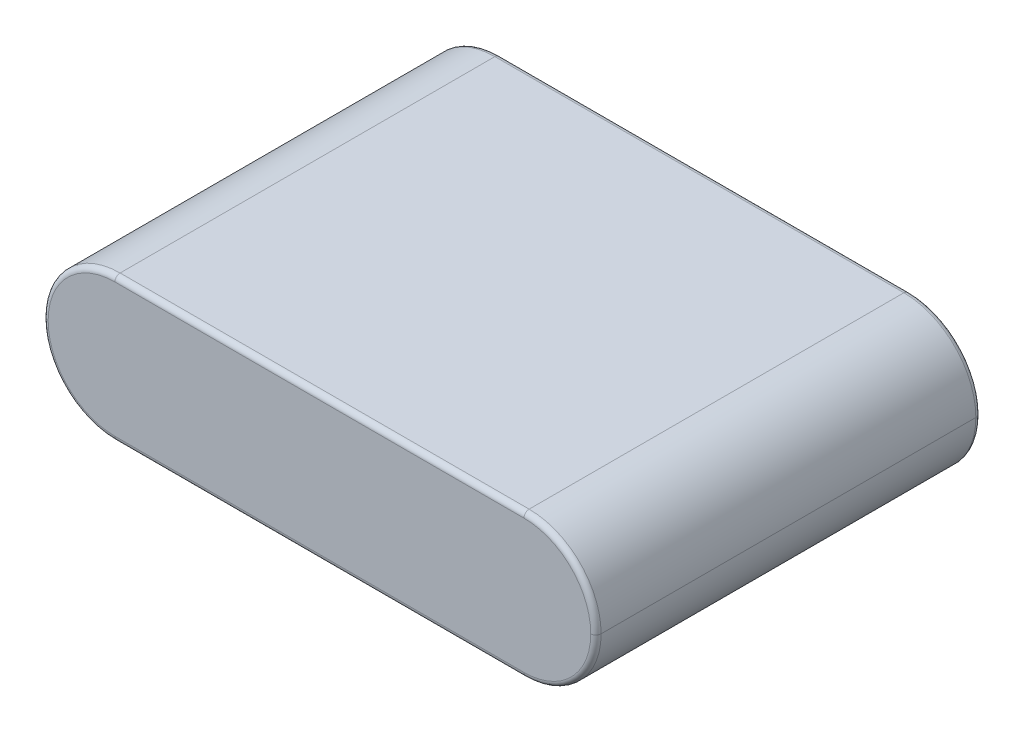
ISO-10303-21;
HEADER;
FILE_DESCRIPTION(('STEP AP214'),'2;1');
FILE_NAME('part.step','',(''),(''),'','','');
FILE_SCHEMA(('AUTOMOTIVE_DESIGN { 1 0 10303 214 1 1 1 1 }'));
ENDSEC;
DATA;
#1=APPLICATION_CONTEXT('core data for automotive mechanical design processes');
#2=APPLICATION_PROTOCOL_DEFINITION('international standard','automotive_design',2000,#1);
#3=PRODUCT_CONTEXT('',#1,'mechanical');
#4=PRODUCT('Part','Part','',(#3));
#5=PRODUCT_RELATED_PRODUCT_CATEGORY('part','',(#4));
#6=PRODUCT_DEFINITION_FORMATION('','',#4);
#7=PRODUCT_DEFINITION_CONTEXT('part definition',#1,'design');
#8=PRODUCT_DEFINITION('design','',#6,#7);
#9=PRODUCT_DEFINITION_SHAPE('','',#8);
#10=(LENGTH_UNIT() NAMED_UNIT(*) SI_UNIT(.MILLI.,.METRE.));
#11=(NAMED_UNIT(*) PLANE_ANGLE_UNIT() SI_UNIT($,.RADIAN.));
#12=(NAMED_UNIT(*) SI_UNIT($,.STERADIAN.) SOLID_ANGLE_UNIT());
#13=UNCERTAINTY_MEASURE_WITH_UNIT(LENGTH_MEASURE(1.E-05),#10,'distance_accuracy_value','');
#14=(GEOMETRIC_REPRESENTATION_CONTEXT(3) GLOBAL_UNCERTAINTY_ASSIGNED_CONTEXT((#13)) GLOBAL_UNIT_ASSIGNED_CONTEXT((#10,
#11,#12)) REPRESENTATION_CONTEXT('',''));
#15=CARTESIAN_POINT('',(0.,0.,0.));
#16=DIRECTION('',(0.,0.,1.));
#17=DIRECTION('',(1.,0.,0.));
#18=AXIS2_PLACEMENT_3D('',#15,#16,#17);
#19=CARTESIAN_POINT('',(0.,27.7,0.));
#20=DIRECTION('',(0.,0.,-1.));
#21=DIRECTION('',(-1.,0.,0.));
#22=AXIS2_PLACEMENT_3D('',#19,#20,#21);
#23=PLANE('',#22);
#24=CARTESIAN_POINT('',(92.55,13.85,0.));
#25=DIRECTION('',(0.,0.,-1.));
#26=DIRECTION('',(-1.,0.,0.));
#27=AXIS2_PLACEMENT_3D('',#24,#25,#26);
#28=CIRCLE('',#27,12.85);
#29=CARTESIAN_POINT('',(105.4,13.85,0.));
#30=VERTEX_POINT('',#29);
#31=CARTESIAN_POINT('',(92.55,26.7,0.));
#32=VERTEX_POINT('',#31);
#33=EDGE_CURVE('E49',#30,#32,#28,.F.);
#34=ORIENTED_EDGE('',*,*,#33,.T.);
#35=DIRECTION('',(1.,0.,0.));
#36=VECTOR('',#35,1.);
#37=CARTESIAN_POINT('',(0.,26.7,0.));
#38=LINE('',#37,#36);
#39=CARTESIAN_POINT('',(13.85,26.7,0.));
#40=VERTEX_POINT('',#39);
#41=EDGE_CURVE('E11',#32,#40,#38,.F.);
#42=ORIENTED_EDGE('',*,*,#41,.T.);
#43=CARTESIAN_POINT('',(13.85,13.85,0.));
#44=DIRECTION('',(0.,0.,-1.));
#45=DIRECTION('',(-1.,0.,0.));
#46=AXIS2_PLACEMENT_3D('',#43,#44,#45);
#47=CIRCLE('',#46,12.85);
#48=CARTESIAN_POINT('',(1.,13.85,0.));
#49=VERTEX_POINT('',#48);
#50=EDGE_CURVE('E200',#40,#49,#47,.F.);
#51=ORIENTED_EDGE('',*,*,#50,.T.);
#52=CARTESIAN_POINT('',(13.85,13.85,0.));
#53=DIRECTION('',(0.,0.,-1.));
#54=DIRECTION('',(-1.,0.,0.));
#55=AXIS2_PLACEMENT_3D('',#52,#53,#54);
#56=CIRCLE('',#55,12.85);
#57=CARTESIAN_POINT('',(13.85,0.999999999999999,0.));
#58=VERTEX_POINT('',#57);
#59=EDGE_CURVE('E203',#49,#58,#56,.F.);
#60=ORIENTED_EDGE('',*,*,#59,.T.);
#61=DIRECTION('',(1.,0.,0.));
#62=VECTOR('',#61,1.);
#63=CARTESIAN_POINT('',(92.55,1.,0.));
#64=LINE('',#63,#62);
#65=CARTESIAN_POINT('',(92.55,1.,0.));
#66=VERTEX_POINT('',#65);
#67=EDGE_CURVE('E206',#58,#66,#64,.T.);
#68=ORIENTED_EDGE('',*,*,#67,.T.);
#69=CARTESIAN_POINT('',(92.55,13.85,0.));
#70=DIRECTION('',(0.,0.,-1.));
#71=DIRECTION('',(-1.,0.,0.));
#72=AXIS2_PLACEMENT_3D('',#69,#70,#71);
#73=CIRCLE('',#72,12.85);
#74=EDGE_CURVE('E60',#66,#30,#73,.F.);
#75=ORIENTED_EDGE('',*,*,#74,.T.);
#76=EDGE_LOOP('',(#34,#42,#51,#60,#68,#75));
#77=FACE_BOUND('',#76,.T.);
#78=ADVANCED_FACE('F39',(#77),#23,.F.);
#79=CARTESIAN_POINT('',(0.,27.7,-74.1));
#80=DIRECTION('',(0.,0.,1.));
#81=DIRECTION('',(1.,0.,0.));
#82=AXIS2_PLACEMENT_3D('',#79,#80,#81);
#83=PLANE('',#82);
#84=CARTESIAN_POINT('',(92.55,13.85,-74.1));
#85=DIRECTION('',(0.,0.,1.));
#86=DIRECTION('',(1.,0.,0.));
#87=AXIS2_PLACEMENT_3D('',#84,#85,#86);
#88=CIRCLE('',#87,12.85);
#89=CARTESIAN_POINT('',(92.55,26.7,-74.1));
#90=VERTEX_POINT('',#89);
#91=CARTESIAN_POINT('',(105.4,13.85,-74.1));
#92=VERTEX_POINT('',#91);
#93=EDGE_CURVE('E155',#90,#92,#88,.F.);
#94=ORIENTED_EDGE('',*,*,#93,.T.);
#95=CARTESIAN_POINT('',(92.55,13.85,-74.1));
#96=DIRECTION('',(0.,0.,1.));
#97=DIRECTION('',(1.,0.,0.));
#98=AXIS2_PLACEMENT_3D('',#95,#96,#97);
#99=CIRCLE('',#98,12.85);
#100=CARTESIAN_POINT('',(92.55,1.,-74.1));
#101=VERTEX_POINT('',#100);
#102=EDGE_CURVE('E134',#92,#101,#99,.F.);
#103=ORIENTED_EDGE('',*,*,#102,.T.);
#104=DIRECTION('',(-1.,0.,0.));
#105=VECTOR('',#104,1.);
#106=CARTESIAN_POINT('',(13.85,1.,-74.1));
#107=LINE('',#106,#105);
#108=CARTESIAN_POINT('',(13.85,1.,-74.1));
#109=VERTEX_POINT('',#108);
#110=EDGE_CURVE('E143',#101,#109,#107,.T.);
#111=ORIENTED_EDGE('',*,*,#110,.T.);
#112=CARTESIAN_POINT('',(13.85,13.85,-74.1));
#113=DIRECTION('',(0.,0.,1.));
#114=DIRECTION('',(1.,0.,0.));
#115=AXIS2_PLACEMENT_3D('',#112,#113,#114);
#116=CIRCLE('',#115,12.85);
#117=CARTESIAN_POINT('',(1.,13.85,-74.1));
#118=VERTEX_POINT('',#117);
#119=EDGE_CURVE('E150',#109,#118,#116,.F.);
#120=ORIENTED_EDGE('',*,*,#119,.T.);
#121=CARTESIAN_POINT('',(13.85,13.85,-74.1));
#122=DIRECTION('',(0.,0.,1.));
#123=DIRECTION('',(1.,0.,0.));
#124=AXIS2_PLACEMENT_3D('',#121,#122,#123);
#125=CIRCLE('',#124,12.85);
#126=CARTESIAN_POINT('',(13.85,26.7,-74.1));
#127=VERTEX_POINT('',#126);
#128=EDGE_CURVE('E295',#118,#127,#125,.F.);
#129=ORIENTED_EDGE('',*,*,#128,.T.);
#130=DIRECTION('',(-1.,0.,0.));
#131=VECTOR('',#130,1.);
#132=CARTESIAN_POINT('',(0.,26.7,-74.1));
#133=LINE('',#132,#131);
#134=EDGE_CURVE('E163',#127,#90,#133,.F.);
#135=ORIENTED_EDGE('',*,*,#134,.T.);
#136=EDGE_LOOP('',(#94,#103,#111,#120,#129,#135));
#137=FACE_BOUND('',#136,.T.);
#138=ADVANCED_FACE('F153',(#137),#83,.F.);
#139=CARTESIAN_POINT('',(0.,27.7,0.));
#140=DIRECTION('',(0.,-1.,0.));
#141=DIRECTION('',(0.,0.,-1.));
#142=AXIS2_PLACEMENT_3D('',#139,#140,#141);
#143=PLANE('',#142);
#144=DIRECTION('',(0.,0.,-1.));
#145=VECTOR('',#144,1.);
#146=CARTESIAN_POINT('',(92.55,27.7,0.));
#147=LINE('',#146,#145);
#148=CARTESIAN_POINT('',(92.55,27.7,-1.));
#149=VERTEX_POINT('',#148);
#150=CARTESIAN_POINT('',(92.55,27.7,-73.1));
#151=VERTEX_POINT('',#150);
#152=EDGE_CURVE('E280',#149,#151,#147,.T.);
#153=ORIENTED_EDGE('',*,*,#152,.T.);
#154=DIRECTION('',(-1.,0.,0.));
#155=VECTOR('',#154,1.);
#156=CARTESIAN_POINT('',(0.,27.7,-73.1));
#157=LINE('',#156,#155);
#158=CARTESIAN_POINT('',(13.85,27.7,-73.1));
#159=VERTEX_POINT('',#158);
#160=EDGE_CURVE('E179',#151,#159,#157,.T.);
#161=ORIENTED_EDGE('',*,*,#160,.T.);
#162=DIRECTION('',(0.,0.,1.));
#163=VECTOR('',#162,1.);
#164=CARTESIAN_POINT('',(13.85,27.7,0.));
#165=LINE('',#164,#163);
#166=CARTESIAN_POINT('',(13.85,27.7,-1.));
#167=VERTEX_POINT('',#166);
#168=EDGE_CURVE('E151',#159,#167,#165,.T.);
#169=ORIENTED_EDGE('',*,*,#168,.T.);
#170=DIRECTION('',(1.,0.,0.));
#171=VECTOR('',#170,1.);
#172=CARTESIAN_POINT('',(0.,27.7,-1.));
#173=LINE('',#172,#171);
#174=EDGE_CURVE('E175',#167,#149,#173,.T.);
#175=ORIENTED_EDGE('',*,*,#174,.T.);
#176=EDGE_LOOP('',(#153,#161,#169,#175));
#177=FACE_BOUND('',#176,.T.);
#178=ADVANCED_FACE('F276',(#177),#143,.F.);
#179=CARTESIAN_POINT('',(0.,0.,0.));
#180=DIRECTION('',(0.,-1.,0.));
#181=DIRECTION('',(0.,0.,-1.));
#182=AXIS2_PLACEMENT_3D('',#179,#180,#181);
#183=PLANE('',#182);
#184=DIRECTION('',(0.,0.,1.));
#185=VECTOR('',#184,1.);
#186=CARTESIAN_POINT('',(13.85,0.,-74.1));
#187=LINE('',#186,#185);
#188=CARTESIAN_POINT('',(13.85,0.,-1.));
#189=VERTEX_POINT('',#188);
#190=CARTESIAN_POINT('',(13.85,0.,-73.1));
#191=VERTEX_POINT('',#190);
#192=EDGE_CURVE('E283',#189,#191,#187,.F.);
#193=ORIENTED_EDGE('',*,*,#192,.T.);
#194=DIRECTION('',(-1.,0.,0.));
#195=VECTOR('',#194,1.);
#196=CARTESIAN_POINT('',(92.55,0.,-73.1));
#197=LINE('',#196,#195);
#198=CARTESIAN_POINT('',(92.55,0.,-73.1));
#199=VERTEX_POINT('',#198);
#200=EDGE_CURVE('E197',#191,#199,#197,.F.);
#201=ORIENTED_EDGE('',*,*,#200,.T.);
#202=DIRECTION('',(0.,0.,-1.));
#203=VECTOR('',#202,1.);
#204=CARTESIAN_POINT('',(92.55,0.,0.));
#205=LINE('',#204,#203);
#206=CARTESIAN_POINT('',(92.55,0.,-1.));
#207=VERTEX_POINT('',#206);
#208=EDGE_CURVE('E289',#199,#207,#205,.F.);
#209=ORIENTED_EDGE('',*,*,#208,.T.);
#210=DIRECTION('',(1.,0.,0.));
#211=VECTOR('',#210,1.);
#212=CARTESIAN_POINT('',(13.85,0.,-1.));
#213=LINE('',#212,#211);
#214=EDGE_CURVE('E194',#207,#189,#213,.F.);
#215=ORIENTED_EDGE('',*,*,#214,.T.);
#216=EDGE_LOOP('',(#193,#201,#209,#215));
#217=FACE_BOUND('',#216,.T.);
#218=ADVANCED_FACE('F321',(#217),#183,.T.);
#219=CARTESIAN_POINT('',(13.85,13.85,0.));
#220=DIRECTION('',(0.,0.,1.));
#221=DIRECTION('',(1.,0.,0.));
#222=AXIS2_PLACEMENT_3D('',#219,#220,#221);
#223=CYLINDRICAL_SURFACE('',#222,13.85);
#224=ORIENTED_EDGE('',*,*,#168,.F.);
#225=CARTESIAN_POINT('',(13.85,13.85,-73.1));
#226=DIRECTION('',(0.,0.,1.));
#227=DIRECTION('',(1.,0.,0.));
#228=AXIS2_PLACEMENT_3D('',#225,#226,#227);
#229=CIRCLE('',#228,13.85);
#230=CARTESIAN_POINT('',(0.,13.85,-73.1));
#231=VERTEX_POINT('',#230);
#232=EDGE_CURVE('E185',#159,#231,#229,.T.);
#233=ORIENTED_EDGE('',*,*,#232,.T.);
#234=DIRECTION('',(0.,0.,1.));
#235=VECTOR('',#234,1.);
#236=CARTESIAN_POINT('',(0.,13.85,0.));
#237=LINE('',#236,#235);
#238=CARTESIAN_POINT('',(0.,13.85,-1.));
#239=VERTEX_POINT('',#238);
#240=EDGE_CURVE('E273',#239,#231,#237,.F.);
#241=ORIENTED_EDGE('',*,*,#240,.F.);
#242=CARTESIAN_POINT('',(13.85,13.85,-1.));
#243=DIRECTION('',(0.,0.,-1.));
#244=DIRECTION('',(-1.,0.,0.));
#245=AXIS2_PLACEMENT_3D('',#242,#243,#244);
#246=CIRCLE('',#245,13.85);
#247=EDGE_CURVE('E182',#239,#167,#246,.T.);
#248=ORIENTED_EDGE('',*,*,#247,.T.);
#249=EDGE_LOOP('',(#224,#233,#241,#248));
#250=FACE_BOUND('',#249,.T.);
#251=ADVANCED_FACE('F270',(#250),#223,.T.);
#252=CARTESIAN_POINT('',(13.85,13.85,0.));
#253=DIRECTION('',(0.,0.,-1.));
#254=DIRECTION('',(-1.,0.,0.));
#255=AXIS2_PLACEMENT_3D('',#252,#253,#254);
#256=CYLINDRICAL_SURFACE('',#255,13.85);
#257=ORIENTED_EDGE('',*,*,#240,.T.);
#258=CARTESIAN_POINT('',(13.85,13.85,-73.1));
#259=DIRECTION('',(0.,0.,1.));
#260=DIRECTION('',(1.,0.,0.));
#261=AXIS2_PLACEMENT_3D('',#258,#259,#260);
#262=CIRCLE('',#261,13.85);
#263=EDGE_CURVE('E191',#231,#191,#262,.T.);
#264=ORIENTED_EDGE('',*,*,#263,.T.);
#265=ORIENTED_EDGE('',*,*,#192,.F.);
#266=CARTESIAN_POINT('',(13.85,13.85,-1.));
#267=DIRECTION('',(0.,0.,-1.));
#268=DIRECTION('',(-1.,0.,0.));
#269=AXIS2_PLACEMENT_3D('',#266,#267,#268);
#270=CIRCLE('',#269,13.85);
#271=EDGE_CURVE('E188',#189,#239,#270,.T.);
#272=ORIENTED_EDGE('',*,*,#271,.T.);
#273=EDGE_LOOP('',(#257,#264,#265,#272));
#274=FACE_BOUND('',#273,.T.);
#275=ADVANCED_FACE('F333',(#274),#256,.T.);
#276=CARTESIAN_POINT('',(92.55,13.85,0.));
#277=DIRECTION('',(0.,0.,1.));
#278=DIRECTION('',(1.,0.,0.));
#279=AXIS2_PLACEMENT_3D('',#276,#277,#278);
#280=CYLINDRICAL_SURFACE('',#279,13.85);
#281=ORIENTED_EDGE('',*,*,#208,.F.);
#282=CARTESIAN_POINT('',(92.55,13.85,-73.1));
#283=DIRECTION('',(0.,0.,1.));
#284=DIRECTION('',(1.,0.,0.));
#285=AXIS2_PLACEMENT_3D('',#282,#283,#284);
#286=CIRCLE('',#285,13.85);
#287=CARTESIAN_POINT('',(106.4,13.85,-73.1));
#288=VERTEX_POINT('',#287);
#289=EDGE_CURVE('E136',#199,#288,#286,.T.);
#290=ORIENTED_EDGE('',*,*,#289,.T.);
#291=DIRECTION('',(0.,0.,-1.));
#292=VECTOR('',#291,1.);
#293=CARTESIAN_POINT('',(106.4,13.85,-74.1));
#294=LINE('',#293,#292);
#295=CARTESIAN_POINT('',(106.4,13.85,-1.));
#296=VERTEX_POINT('',#295);
#297=EDGE_CURVE('E229',#296,#288,#294,.T.);
#298=ORIENTED_EDGE('',*,*,#297,.F.);
#299=CARTESIAN_POINT('',(92.55,13.85,-1.));
#300=DIRECTION('',(0.,0.,-1.));
#301=DIRECTION('',(-1.,0.,0.));
#302=AXIS2_PLACEMENT_3D('',#299,#300,#301);
#303=CIRCLE('',#302,13.85);
#304=EDGE_CURVE('E158',#296,#207,#303,.T.);
#305=ORIENTED_EDGE('',*,*,#304,.T.);
#306=EDGE_LOOP('',(#281,#290,#298,#305));
#307=FACE_BOUND('',#306,.T.);
#308=ADVANCED_FACE('F311',(#307),#280,.T.);
#309=CARTESIAN_POINT('',(92.55,13.85,0.));
#310=DIRECTION('',(0.,0.,-1.));
#311=DIRECTION('',(-1.,0.,0.));
#312=AXIS2_PLACEMENT_3D('',#309,#310,#311);
#313=CYLINDRICAL_SURFACE('',#312,13.85);
#314=ORIENTED_EDGE('',*,*,#297,.T.);
#315=CARTESIAN_POINT('',(92.55,13.85,-73.1));
#316=DIRECTION('',(0.,0.,1.));
#317=DIRECTION('',(1.,0.,0.));
#318=AXIS2_PLACEMENT_3D('',#315,#316,#317);
#319=CIRCLE('',#318,13.85);
#320=EDGE_CURVE('E172',#288,#151,#319,.T.);
#321=ORIENTED_EDGE('',*,*,#320,.T.);
#322=ORIENTED_EDGE('',*,*,#152,.F.);
#323=CARTESIAN_POINT('',(92.55,13.85,-1.));
#324=DIRECTION('',(0.,0.,-1.));
#325=DIRECTION('',(-1.,0.,0.));
#326=AXIS2_PLACEMENT_3D('',#323,#324,#325);
#327=CIRCLE('',#326,13.85);
#328=EDGE_CURVE('E169',#149,#296,#327,.T.);
#329=ORIENTED_EDGE('',*,*,#328,.T.);
#330=EDGE_LOOP('',(#314,#321,#322,#329));
#331=FACE_BOUND('',#330,.T.);
#332=ADVANCED_FACE('F313',(#331),#313,.T.);
#333=CARTESIAN_POINT('',(13.85,13.85,-73.1));
#334=DIRECTION('',(0.,0.,1.));
#335=DIRECTION('',(1.,0.,0.));
#336=AXIS2_PLACEMENT_3D('',#333,#334,#335);
#337=TOROIDAL_SURFACE('',#336,12.85,1.);
#338=CARTESIAN_POINT('',(1.,13.85,-73.1));
#339=DIRECTION('',(0.,-1.,0.));
#340=DIRECTION('',(0.,0.,-1.));
#341=AXIS2_PLACEMENT_3D('',#338,#339,#340);
#342=CIRCLE('',#341,1.);
#343=EDGE_CURVE('E221',#231,#118,#342,.T.);
#344=ORIENTED_EDGE('',*,*,#343,.F.);
#345=ORIENTED_EDGE('',*,*,#232,.F.);
#346=CARTESIAN_POINT('',(13.85,26.7,-73.1));
#347=DIRECTION('',(1.,0.,0.));
#348=DIRECTION('',(0.,0.,-1.));
#349=AXIS2_PLACEMENT_3D('',#346,#347,#348);
#350=CIRCLE('',#349,1.);
#351=EDGE_CURVE('E225',#127,#159,#350,.T.);
#352=ORIENTED_EDGE('',*,*,#351,.F.);
#353=ORIENTED_EDGE('',*,*,#128,.F.);
#354=EDGE_LOOP('',(#344,#345,#352,#353));
#355=FACE_BOUND('',#354,.T.);
#356=ADVANCED_FACE('F332',(#355),#337,.T.);
#357=CARTESIAN_POINT('',(0.,26.7,-73.1));
#358=DIRECTION('',(-1.,0.,0.));
#359=DIRECTION('',(0.,0.,1.));
#360=AXIS2_PLACEMENT_3D('',#357,#358,#359);
#361=CYLINDRICAL_SURFACE('',#360,1.);
#362=ORIENTED_EDGE('',*,*,#351,.T.);
#363=ORIENTED_EDGE('',*,*,#160,.F.);
#364=CARTESIAN_POINT('',(92.55,26.7,-73.1));
#365=DIRECTION('',(1.,0.,0.));
#366=DIRECTION('',(0.,0.,-1.));
#367=AXIS2_PLACEMENT_3D('',#364,#365,#366);
#368=CIRCLE('',#367,1.);
#369=EDGE_CURVE('E217',#90,#151,#368,.T.);
#370=ORIENTED_EDGE('',*,*,#369,.F.);
#371=ORIENTED_EDGE('',*,*,#134,.F.);
#372=EDGE_LOOP('',(#362,#363,#370,#371));
#373=FACE_BOUND('',#372,.T.);
#374=ADVANCED_FACE('F303',(#373),#361,.T.);
#375=CARTESIAN_POINT('',(13.85,13.85,-73.1));
#376=DIRECTION('',(0.,0.,1.));
#377=DIRECTION('',(1.,0.,0.));
#378=AXIS2_PLACEMENT_3D('',#375,#376,#377);
#379=TOROIDAL_SURFACE('',#378,12.85,1.);
#380=ORIENTED_EDGE('',*,*,#343,.T.);
#381=ORIENTED_EDGE('',*,*,#119,.F.);
#382=CARTESIAN_POINT('',(13.85,1.,-73.1));
#383=DIRECTION('',(1.,0.,0.));
#384=DIRECTION('',(0.,0.,-1.));
#385=AXIS2_PLACEMENT_3D('',#382,#383,#384);
#386=CIRCLE('',#385,1.);
#387=EDGE_CURVE('E146',#191,#109,#386,.T.);
#388=ORIENTED_EDGE('',*,*,#387,.F.);
#389=ORIENTED_EDGE('',*,*,#263,.F.);
#390=EDGE_LOOP('',(#380,#381,#388,#389));
#391=FACE_BOUND('',#390,.T.);
#392=ADVANCED_FACE('F329',(#391),#379,.T.);
#393=CARTESIAN_POINT('',(92.55,13.85,-73.1));
#394=DIRECTION('',(0.,0.,1.));
#395=DIRECTION('',(1.,0.,0.));
#396=AXIS2_PLACEMENT_3D('',#393,#394,#395);
#397=TOROIDAL_SURFACE('',#396,12.85,1.);
#398=ORIENTED_EDGE('',*,*,#369,.T.);
#399=ORIENTED_EDGE('',*,*,#320,.F.);
#400=CARTESIAN_POINT('',(105.4,13.85,-73.1));
#401=DIRECTION('',(0.,-1.,0.));
#402=DIRECTION('',(0.,0.,-1.));
#403=AXIS2_PLACEMENT_3D('',#400,#401,#402);
#404=CIRCLE('',#403,1.);
#405=EDGE_CURVE('E140',#92,#288,#404,.T.);
#406=ORIENTED_EDGE('',*,*,#405,.F.);
#407=ORIENTED_EDGE('',*,*,#93,.F.);
#408=EDGE_LOOP('',(#398,#399,#406,#407));
#409=FACE_BOUND('',#408,.T.);
#410=ADVANCED_FACE('F306',(#409),#397,.T.);
#411=CARTESIAN_POINT('',(0.,1.,-73.1));
#412=DIRECTION('',(1.,0.,0.));
#413=DIRECTION('',(0.,0.,-1.));
#414=AXIS2_PLACEMENT_3D('',#411,#412,#413);
#415=CYLINDRICAL_SURFACE('',#414,1.);
#416=ORIENTED_EDGE('',*,*,#387,.T.);
#417=ORIENTED_EDGE('',*,*,#110,.F.);
#418=CARTESIAN_POINT('',(92.55,1.,-73.1));
#419=DIRECTION('',(1.,0.,0.));
#420=DIRECTION('',(0.,0.,-1.));
#421=AXIS2_PLACEMENT_3D('',#418,#419,#420);
#422=CIRCLE('',#421,1.);
#423=EDGE_CURVE('E130',#199,#101,#422,.T.);
#424=ORIENTED_EDGE('',*,*,#423,.F.);
#425=ORIENTED_EDGE('',*,*,#200,.F.);
#426=EDGE_LOOP('',(#416,#417,#424,#425));
#427=FACE_BOUND('',#426,.T.);
#428=ADVANCED_FACE('F144',(#427),#415,.T.);
#429=CARTESIAN_POINT('',(92.55,13.85,-73.1));
#430=DIRECTION('',(0.,0.,1.));
#431=DIRECTION('',(1.,0.,0.));
#432=AXIS2_PLACEMENT_3D('',#429,#430,#431);
#433=TOROIDAL_SURFACE('',#432,12.85,1.);
#434=ORIENTED_EDGE('',*,*,#405,.T.);
#435=ORIENTED_EDGE('',*,*,#289,.F.);
#436=ORIENTED_EDGE('',*,*,#423,.T.);
#437=ORIENTED_EDGE('',*,*,#102,.F.);
#438=EDGE_LOOP('',(#434,#435,#436,#437));
#439=FACE_BOUND('',#438,.T.);
#440=ADVANCED_FACE('F132',(#439),#433,.T.);
#441=CARTESIAN_POINT('',(0.,1.,-1.));
#442=DIRECTION('',(-1.,0.,0.));
#443=DIRECTION('',(0.,0.,1.));
#444=AXIS2_PLACEMENT_3D('',#441,#442,#443);
#445=CYLINDRICAL_SURFACE('',#444,1.);
#446=CARTESIAN_POINT('',(92.55,1.,-1.));
#447=DIRECTION('',(1.,0.,0.));
#448=DIRECTION('',(0.,0.,-1.));
#449=AXIS2_PLACEMENT_3D('',#446,#447,#448);
#450=CIRCLE('',#449,1.);
#451=EDGE_CURVE('E243',#66,#207,#450,.T.);
#452=ORIENTED_EDGE('',*,*,#451,.F.);
#453=ORIENTED_EDGE('',*,*,#67,.F.);
#454=CARTESIAN_POINT('',(13.85,1.,-1.));
#455=DIRECTION('',(-1.,0.,0.));
#456=DIRECTION('',(0.,0.,1.));
#457=AXIS2_PLACEMENT_3D('',#454,#455,#456);
#458=CIRCLE('',#457,1.);
#459=EDGE_CURVE('E43',#189,#58,#458,.T.);
#460=ORIENTED_EDGE('',*,*,#459,.F.);
#461=ORIENTED_EDGE('',*,*,#214,.F.);
#462=EDGE_LOOP('',(#452,#453,#460,#461));
#463=FACE_BOUND('',#462,.T.);
#464=ADVANCED_FACE('F41',(#463),#445,.T.);
#465=CARTESIAN_POINT('',(13.85,13.85,-1.));
#466=DIRECTION('',(0.,0.,-1.));
#467=DIRECTION('',(-1.,0.,0.));
#468=AXIS2_PLACEMENT_3D('',#465,#466,#467);
#469=TOROIDAL_SURFACE('',#468,12.85,1.);
#470=ORIENTED_EDGE('',*,*,#459,.T.);
#471=ORIENTED_EDGE('',*,*,#59,.F.);
#472=CARTESIAN_POINT('',(1.,13.85,-1.));
#473=DIRECTION('',(0.,1.,0.));
#474=DIRECTION('',(0.,0.,1.));
#475=AXIS2_PLACEMENT_3D('',#472,#473,#474);
#476=CIRCLE('',#475,1.);
#477=EDGE_CURVE('E240',#239,#49,#476,.T.);
#478=ORIENTED_EDGE('',*,*,#477,.F.);
#479=ORIENTED_EDGE('',*,*,#271,.F.);
#480=EDGE_LOOP('',(#470,#471,#478,#479));
#481=FACE_BOUND('',#480,.T.);
#482=ADVANCED_FACE('F255',(#481),#469,.T.);
#483=CARTESIAN_POINT('',(92.55,13.85,-1.));
#484=DIRECTION('',(0.,0.,-1.));
#485=DIRECTION('',(-1.,0.,0.));
#486=AXIS2_PLACEMENT_3D('',#483,#484,#485);
#487=TOROIDAL_SURFACE('',#486,12.85,1.);
#488=ORIENTED_EDGE('',*,*,#451,.T.);
#489=ORIENTED_EDGE('',*,*,#304,.F.);
#490=CARTESIAN_POINT('',(105.4,13.85,-1.));
#491=DIRECTION('',(0.,1.,0.));
#492=DIRECTION('',(0.,0.,1.));
#493=AXIS2_PLACEMENT_3D('',#490,#491,#492);
#494=CIRCLE('',#493,1.);
#495=EDGE_CURVE('E236',#30,#296,#494,.T.);
#496=ORIENTED_EDGE('',*,*,#495,.F.);
#497=ORIENTED_EDGE('',*,*,#74,.F.);
#498=EDGE_LOOP('',(#488,#489,#496,#497));
#499=FACE_BOUND('',#498,.T.);
#500=ADVANCED_FACE('F318',(#499),#487,.T.);
#501=CARTESIAN_POINT('',(13.85,13.85,-1.));
#502=DIRECTION('',(0.,0.,-1.));
#503=DIRECTION('',(-1.,0.,0.));
#504=AXIS2_PLACEMENT_3D('',#501,#502,#503);
#505=TOROIDAL_SURFACE('',#504,12.85,1.);
#506=ORIENTED_EDGE('',*,*,#477,.T.);
#507=ORIENTED_EDGE('',*,*,#50,.F.);
#508=CARTESIAN_POINT('',(13.85,26.7,-1.));
#509=DIRECTION('',(1.,0.,0.));
#510=DIRECTION('',(0.,0.,-1.));
#511=AXIS2_PLACEMENT_3D('',#508,#509,#510);
#512=CIRCLE('',#511,1.);
#513=EDGE_CURVE('E233',#167,#40,#512,.T.);
#514=ORIENTED_EDGE('',*,*,#513,.F.);
#515=ORIENTED_EDGE('',*,*,#247,.F.);
#516=EDGE_LOOP('',(#506,#507,#514,#515));
#517=FACE_BOUND('',#516,.T.);
#518=ADVANCED_FACE('F263',(#517),#505,.T.);
#519=CARTESIAN_POINT('',(92.55,13.85,-1.));
#520=DIRECTION('',(0.,0.,-1.));
#521=DIRECTION('',(-1.,0.,0.));
#522=AXIS2_PLACEMENT_3D('',#519,#520,#521);
#523=TOROIDAL_SURFACE('',#522,12.85,1.);
#524=ORIENTED_EDGE('',*,*,#495,.T.);
#525=ORIENTED_EDGE('',*,*,#328,.F.);
#526=CARTESIAN_POINT('',(92.55,26.7,-1.));
#527=DIRECTION('',(-1.,0.,0.));
#528=DIRECTION('',(0.,0.,1.));
#529=AXIS2_PLACEMENT_3D('',#526,#527,#528);
#530=CIRCLE('',#529,1.);
#531=EDGE_CURVE('E230',#32,#149,#530,.T.);
#532=ORIENTED_EDGE('',*,*,#531,.F.);
#533=ORIENTED_EDGE('',*,*,#33,.F.);
#534=EDGE_LOOP('',(#524,#525,#532,#533));
#535=FACE_BOUND('',#534,.T.);
#536=ADVANCED_FACE('F317',(#535),#523,.T.);
#537=CARTESIAN_POINT('',(0.,26.7,-1.));
#538=DIRECTION('',(1.,0.,0.));
#539=DIRECTION('',(0.,0.,-1.));
#540=AXIS2_PLACEMENT_3D('',#537,#538,#539);
#541=CYLINDRICAL_SURFACE('',#540,1.);
#542=ORIENTED_EDGE('',*,*,#513,.T.);
#543=ORIENTED_EDGE('',*,*,#41,.F.);
#544=ORIENTED_EDGE('',*,*,#531,.T.);
#545=ORIENTED_EDGE('',*,*,#174,.F.);
#546=EDGE_LOOP('',(#542,#543,#544,#545));
#547=FACE_BOUND('',#546,.T.);
#548=ADVANCED_FACE('F469',(#547),#541,.T.);
#549=CLOSED_SHELL('',(#78,#138,#178,#218,#251,#275,#308,#332,#356,#374,#392,#410,#428,#440,#464,
#482,#500,#518,#536,#548));
#550=MANIFOLD_SOLID_BREP('B2',#549);
#551=ADVANCED_BREP_SHAPE_REPRESENTATION('',(#18,#550),#14);
#552=SHAPE_DEFINITION_REPRESENTATION(#9,#551);
ENDSEC;
END-ISO-10303-21;
